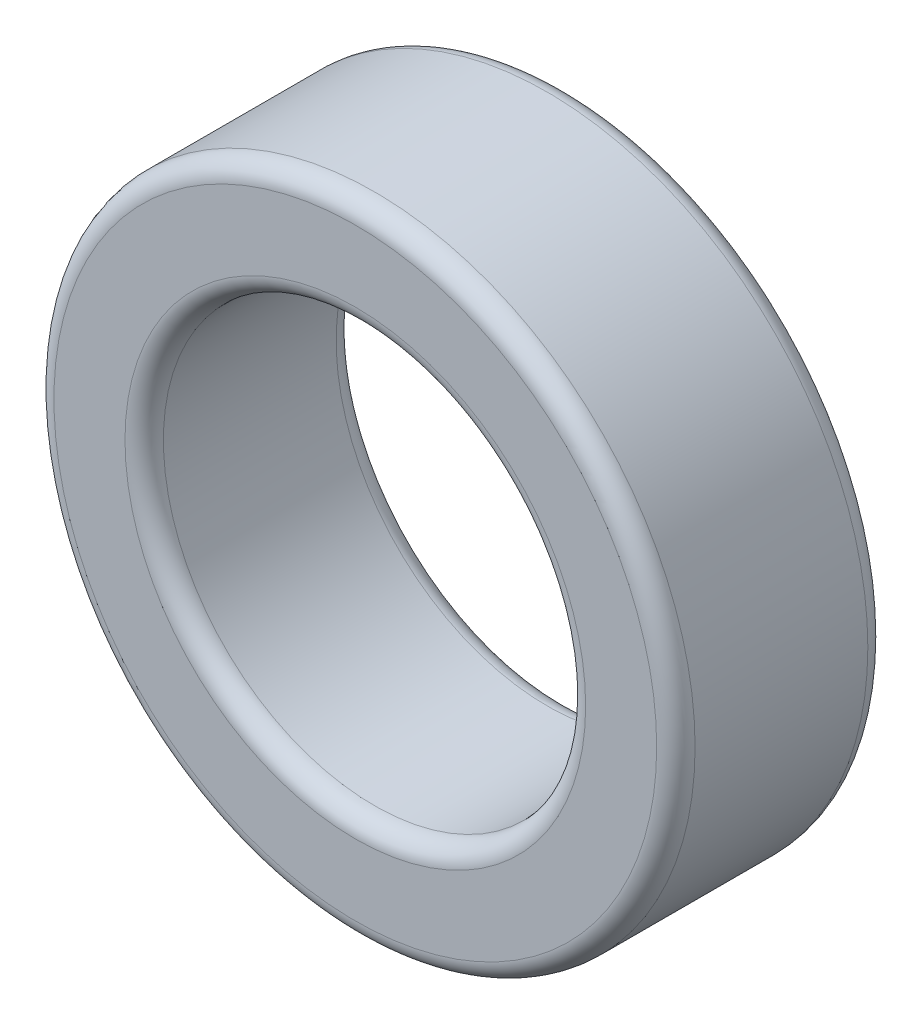
ISO-10303-21;
HEADER;
FILE_DESCRIPTION(('STEP AP214'),'2;1');
FILE_NAME('part.step','',(''),(''),'','','');
FILE_SCHEMA(('AUTOMOTIVE_DESIGN { 1 0 10303 214 1 1 1 1 }'));
ENDSEC;
DATA;
#1=APPLICATION_CONTEXT('core data for automotive mechanical design processes');
#2=APPLICATION_PROTOCOL_DEFINITION('international standard','automotive_design',2000,#1);
#3=PRODUCT_CONTEXT('',#1,'mechanical');
#4=PRODUCT('Part','Part','',(#3));
#5=PRODUCT_RELATED_PRODUCT_CATEGORY('part','',(#4));
#6=PRODUCT_DEFINITION_FORMATION('','',#4);
#7=PRODUCT_DEFINITION_CONTEXT('part definition',#1,'design');
#8=PRODUCT_DEFINITION('design','',#6,#7);
#9=PRODUCT_DEFINITION_SHAPE('','',#8);
#10=(LENGTH_UNIT() NAMED_UNIT(*) SI_UNIT(.MILLI.,.METRE.));
#11=(NAMED_UNIT(*) PLANE_ANGLE_UNIT() SI_UNIT($,.RADIAN.));
#12=(NAMED_UNIT(*) SI_UNIT($,.STERADIAN.) SOLID_ANGLE_UNIT());
#13=UNCERTAINTY_MEASURE_WITH_UNIT(LENGTH_MEASURE(1.E-05),#10,'distance_accuracy_value','');
#14=(GEOMETRIC_REPRESENTATION_CONTEXT(3) GLOBAL_UNCERTAINTY_ASSIGNED_CONTEXT((#13)) GLOBAL_UNIT_ASSIGNED_CONTEXT((#10,
#11,#12)) REPRESENTATION_CONTEXT('',''));
#15=CARTESIAN_POINT('',(0.,0.,0.));
#16=DIRECTION('',(0.,0.,1.));
#17=DIRECTION('',(1.,0.,0.));
#18=AXIS2_PLACEMENT_3D('',#15,#16,#17);
#19=CARTESIAN_POINT('',(0.,0.,13.97));
#20=DIRECTION('',(0.,0.,1.));
#21=DIRECTION('',(1.,0.,0.));
#22=AXIS2_PLACEMENT_3D('',#19,#20,#21);
#23=PLANE('',#22);
#24=CARTESIAN_POINT('',(0.,0.,13.97));
#25=DIRECTION('',(0.,0.,1.));
#26=DIRECTION('',(1.,0.,0.));
#27=AXIS2_PLACEMENT_3D('',#24,#25,#26);
#28=CIRCLE('',#27,19.939);
#29=CARTESIAN_POINT('',(19.939,0.,13.97));
#30=VERTEX_POINT('',#29);
#31=EDGE_CURVE('E42',#30,#30,#28,.T.);
#32=ORIENTED_EDGE('',*,*,#31,.T.);
#33=EDGE_LOOP('',(#32));
#34=FACE_BOUND('',#33,.T.);
#35=CARTESIAN_POINT('',(0.,0.,13.97));
#36=DIRECTION('',(0.,0.,1.));
#37=DIRECTION('',(1.,0.,0.));
#38=AXIS2_PLACEMENT_3D('',#35,#36,#37);
#39=CIRCLE('',#38,15.24);
#40=CARTESIAN_POINT('',(15.24,0.,13.97));
#41=VERTEX_POINT('',#40);
#42=EDGE_CURVE('E46',#41,#41,#39,.F.);
#43=ORIENTED_EDGE('',*,*,#42,.T.);
#44=EDGE_LOOP('',(#43));
#45=FACE_BOUND('',#44,.T.);
#46=ADVANCED_FACE('F31',(#34,#45),#23,.T.);
#47=CARTESIAN_POINT('',(0.,0.,0.));
#48=DIRECTION('',(0.,0.,1.));
#49=DIRECTION('',(1.,0.,0.));
#50=AXIS2_PLACEMENT_3D('',#47,#48,#49);
#51=PLANE('',#50);
#52=CARTESIAN_POINT('',(0.,0.,0.));
#53=DIRECTION('',(0.,0.,1.));
#54=DIRECTION('',(1.,0.,0.));
#55=AXIS2_PLACEMENT_3D('',#52,#53,#54);
#56=CIRCLE('',#55,19.939);
#57=CARTESIAN_POINT('',(19.939,0.,0.));
#58=VERTEX_POINT('',#57);
#59=EDGE_CURVE('E51',#58,#58,#56,.F.);
#60=ORIENTED_EDGE('',*,*,#59,.T.);
#61=EDGE_LOOP('',(#60));
#62=FACE_BOUND('',#61,.T.);
#63=CARTESIAN_POINT('',(0.,0.,0.));
#64=DIRECTION('',(0.,0.,1.));
#65=DIRECTION('',(1.,0.,0.));
#66=AXIS2_PLACEMENT_3D('',#63,#64,#65);
#67=CIRCLE('',#66,15.24);
#68=CARTESIAN_POINT('',(15.24,0.,0.));
#69=VERTEX_POINT('',#68);
#70=EDGE_CURVE('E54',#69,#69,#67,.T.);
#71=ORIENTED_EDGE('',*,*,#70,.T.);
#72=EDGE_LOOP('',(#71));
#73=FACE_BOUND('',#72,.T.);
#74=ADVANCED_FACE('F76',(#62,#73),#51,.F.);
#75=CARTESIAN_POINT('',(0.,0.,13.97));
#76=DIRECTION('',(0.,0.,-1.));
#77=DIRECTION('',(-1.,0.,0.));
#78=AXIS2_PLACEMENT_3D('',#75,#76,#77);
#79=CYLINDRICAL_SURFACE('',#78,21.209);
#80=CARTESIAN_POINT('',(0.,0.,1.27));
#81=DIRECTION('',(0.,0.,1.));
#82=DIRECTION('',(1.,0.,0.));
#83=AXIS2_PLACEMENT_3D('',#80,#81,#82);
#84=CIRCLE('',#83,21.209);
#85=CARTESIAN_POINT('',(21.209,0.,1.27));
#86=VERTEX_POINT('',#85);
#87=EDGE_CURVE('E57',#86,#86,#84,.T.);
#88=ORIENTED_EDGE('',*,*,#87,.T.);
#89=EDGE_LOOP('',(#88));
#90=FACE_BOUND('',#89,.T.);
#91=CARTESIAN_POINT('',(0.,0.,12.7));
#92=DIRECTION('',(0.,0.,1.));
#93=DIRECTION('',(1.,0.,0.));
#94=AXIS2_PLACEMENT_3D('',#91,#92,#93);
#95=CIRCLE('',#94,21.209);
#96=CARTESIAN_POINT('',(21.209,0.,12.7));
#97=VERTEX_POINT('',#96);
#98=EDGE_CURVE('E60',#97,#97,#95,.F.);
#99=ORIENTED_EDGE('',*,*,#98,.T.);
#100=EDGE_LOOP('',(#99));
#101=FACE_BOUND('',#100,.T.);
#102=ADVANCED_FACE('F64',(#90,#101),#79,.T.);
#103=CARTESIAN_POINT('',(0.,0.,13.97));
#104=DIRECTION('',(0.,0.,-1.));
#105=DIRECTION('',(-1.,0.,0.));
#106=AXIS2_PLACEMENT_3D('',#103,#104,#105);
#107=CYLINDRICAL_SURFACE('',#106,13.97);
#108=CARTESIAN_POINT('',(0.,0.,1.27));
#109=DIRECTION('',(0.,0.,1.));
#110=DIRECTION('',(1.,0.,0.));
#111=AXIS2_PLACEMENT_3D('',#108,#109,#110);
#112=CIRCLE('',#111,13.97);
#113=CARTESIAN_POINT('',(13.97,0.,1.27));
#114=VERTEX_POINT('',#113);
#115=EDGE_CURVE('E10',#114,#114,#112,.F.);
#116=ORIENTED_EDGE('',*,*,#115,.T.);
#117=EDGE_LOOP('',(#116));
#118=FACE_BOUND('',#117,.T.);
#119=CARTESIAN_POINT('',(0.,0.,12.7));
#120=DIRECTION('',(0.,0.,1.));
#121=DIRECTION('',(1.,0.,0.));
#122=AXIS2_PLACEMENT_3D('',#119,#120,#121);
#123=CIRCLE('',#122,13.97);
#124=CARTESIAN_POINT('',(13.97,0.,12.7));
#125=VERTEX_POINT('',#124);
#126=EDGE_CURVE('E38',#125,#125,#123,.T.);
#127=ORIENTED_EDGE('',*,*,#126,.T.);
#128=EDGE_LOOP('',(#127));
#129=FACE_BOUND('',#128,.T.);
#130=ADVANCED_FACE('F92',(#118,#129),#107,.F.);
#131=CARTESIAN_POINT('',(0.,0.,1.27));
#132=DIRECTION('',(0.,0.,1.));
#133=DIRECTION('',(1.,0.,0.));
#134=AXIS2_PLACEMENT_3D('',#131,#132,#133);
#135=TOROIDAL_SURFACE('',#134,19.939,1.27);
#136=ORIENTED_EDGE('',*,*,#59,.F.);
#137=EDGE_LOOP('',(#136));
#138=FACE_BOUND('',#137,.T.);
#139=ORIENTED_EDGE('',*,*,#87,.F.);
#140=EDGE_LOOP('',(#139));
#141=FACE_BOUND('',#140,.T.);
#142=ADVANCED_FACE('F70',(#138,#141),#135,.T.);
#143=CARTESIAN_POINT('',(0.,0.,12.7));
#144=DIRECTION('',(0.,0.,1.));
#145=DIRECTION('',(1.,0.,0.));
#146=AXIS2_PLACEMENT_3D('',#143,#144,#145);
#147=TOROIDAL_SURFACE('',#146,19.939,1.27);
#148=ORIENTED_EDGE('',*,*,#98,.F.);
#149=EDGE_LOOP('',(#148));
#150=FACE_BOUND('',#149,.T.);
#151=ORIENTED_EDGE('',*,*,#31,.F.);
#152=EDGE_LOOP('',(#151));
#153=FACE_BOUND('',#152,.T.);
#154=ADVANCED_FACE('F66',(#150,#153),#147,.T.);
#155=CARTESIAN_POINT('',(0.,0.,1.27));
#156=DIRECTION('',(0.,0.,1.));
#157=DIRECTION('',(1.,0.,0.));
#158=AXIS2_PLACEMENT_3D('',#155,#156,#157);
#159=TOROIDAL_SURFACE('',#158,15.24,1.27);
#160=ORIENTED_EDGE('',*,*,#115,.F.);
#161=EDGE_LOOP('',(#160));
#162=FACE_BOUND('',#161,.T.);
#163=ORIENTED_EDGE('',*,*,#70,.F.);
#164=EDGE_LOOP('',(#163));
#165=FACE_BOUND('',#164,.T.);
#166=ADVANCED_FACE('F69',(#162,#165),#159,.T.);
#167=CARTESIAN_POINT('',(0.,0.,12.7));
#168=DIRECTION('',(0.,0.,1.));
#169=DIRECTION('',(1.,0.,0.));
#170=AXIS2_PLACEMENT_3D('',#167,#168,#169);
#171=TOROIDAL_SURFACE('',#170,15.24,1.27);
#172=ORIENTED_EDGE('',*,*,#42,.F.);
#173=EDGE_LOOP('',(#172));
#174=FACE_BOUND('',#173,.T.);
#175=ORIENTED_EDGE('',*,*,#126,.F.);
#176=EDGE_LOOP('',(#175));
#177=FACE_BOUND('',#176,.T.);
#178=ADVANCED_FACE('F33',(#174,#177),#171,.T.);
#179=CLOSED_SHELL('',(#46,#74,#102,#130,#142,#154,#166,#178));
#180=MANIFOLD_SOLID_BREP('B2',#179);
#181=ADVANCED_BREP_SHAPE_REPRESENTATION('',(#18,#180),#14);
#182=SHAPE_DEFINITION_REPRESENTATION(#9,#181);
ENDSEC;
END-ISO-10303-21;
